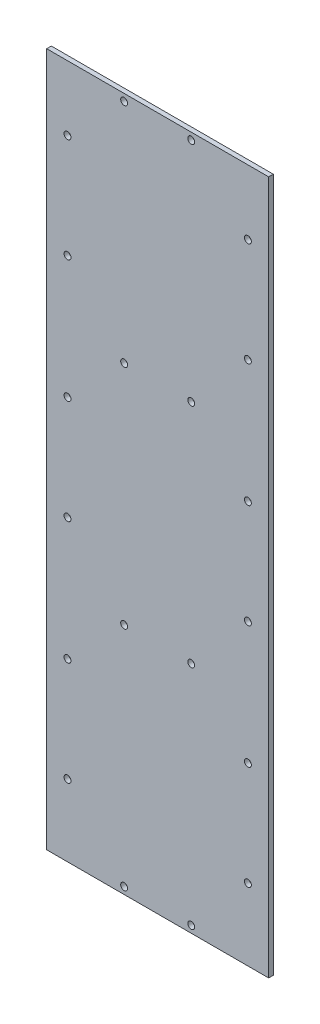
ISO-10303-21;
HEADER;
FILE_DESCRIPTION(('STEP AP214'),'2;1');
FILE_NAME('part.step','',(''),(''),'','','');
FILE_SCHEMA(('AUTOMOTIVE_DESIGN { 1 0 10303 214 1 1 1 1 }'));
ENDSEC;
DATA;
#1=APPLICATION_CONTEXT('core data for automotive mechanical design processes');
#2=APPLICATION_PROTOCOL_DEFINITION('international standard','automotive_design',2000,#1);
#3=PRODUCT_CONTEXT('',#1,'mechanical');
#4=PRODUCT('Part','Part','',(#3));
#5=PRODUCT_RELATED_PRODUCT_CATEGORY('part','',(#4));
#6=PRODUCT_DEFINITION_FORMATION('','',#4);
#7=PRODUCT_DEFINITION_CONTEXT('part definition',#1,'design');
#8=PRODUCT_DEFINITION('design','',#6,#7);
#9=PRODUCT_DEFINITION_SHAPE('','',#8);
#10=(LENGTH_UNIT() NAMED_UNIT(*) SI_UNIT(.MILLI.,.METRE.));
#11=(NAMED_UNIT(*) PLANE_ANGLE_UNIT() SI_UNIT($,.RADIAN.));
#12=(NAMED_UNIT(*) SI_UNIT($,.STERADIAN.) SOLID_ANGLE_UNIT());
#13=UNCERTAINTY_MEASURE_WITH_UNIT(LENGTH_MEASURE(1.E-05),#10,'distance_accuracy_value','');
#14=(GEOMETRIC_REPRESENTATION_CONTEXT(3) GLOBAL_UNCERTAINTY_ASSIGNED_CONTEXT((#13)) GLOBAL_UNIT_ASSIGNED_CONTEXT((#10,
#11,#12)) REPRESENTATION_CONTEXT('',''));
#15=CARTESIAN_POINT('',(0.,0.,0.));
#16=DIRECTION('',(0.,0.,1.));
#17=DIRECTION('',(1.,0.,0.));
#18=AXIS2_PLACEMENT_3D('',#15,#16,#17);
#19=CARTESIAN_POINT('',(-48.,-150.,2.));
#20=DIRECTION('',(1.,0.,0.));
#21=DIRECTION('',(0.,0.,-1.));
#22=AXIS2_PLACEMENT_3D('',#19,#20,#21);
#23=PLANE('',#22);
#24=DIRECTION('',(0.,-1.,0.));
#25=VECTOR('',#24,1.);
#26=CARTESIAN_POINT('',(-48.,-150.,0.));
#27=LINE('',#26,#25);
#28=CARTESIAN_POINT('',(-48.,150.,0.));
#29=VERTEX_POINT('',#28);
#30=CARTESIAN_POINT('',(-48.,-150.,0.));
#31=VERTEX_POINT('',#30);
#32=EDGE_CURVE('E102',#29,#31,#27,.T.);
#33=ORIENTED_EDGE('',*,*,#32,.T.);
#34=DIRECTION('',(0.,0.,-1.));
#35=VECTOR('',#34,1.);
#36=CARTESIAN_POINT('',(-48.,-150.,2.));
#37=LINE('',#36,#35);
#38=CARTESIAN_POINT('',(-48.,-150.,2.));
#39=VERTEX_POINT('',#38);
#40=EDGE_CURVE('E11',#39,#31,#37,.T.);
#41=ORIENTED_EDGE('',*,*,#40,.F.);
#42=DIRECTION('',(0.,-1.,0.));
#43=VECTOR('',#42,1.);
#44=CARTESIAN_POINT('',(-48.,-150.,2.));
#45=LINE('',#44,#43);
#46=CARTESIAN_POINT('',(-48.,150.,2.));
#47=VERTEX_POINT('',#46);
#48=EDGE_CURVE('E89',#47,#39,#45,.T.);
#49=ORIENTED_EDGE('',*,*,#48,.F.);
#50=DIRECTION('',(0.,0.,-1.));
#51=VECTOR('',#50,1.);
#52=CARTESIAN_POINT('',(-48.,150.,2.));
#53=LINE('',#52,#51);
#54=EDGE_CURVE('E98',#47,#29,#53,.T.);
#55=ORIENTED_EDGE('',*,*,#54,.T.);
#56=EDGE_LOOP('',(#33,#41,#49,#55));
#57=FACE_BOUND('',#56,.T.);
#58=ADVANCED_FACE('F36',(#57),#23,.F.);
#59=CARTESIAN_POINT('',(48.,-150.,2.));
#60=DIRECTION('',(0.,1.,0.));
#61=DIRECTION('',(0.,0.,1.));
#62=AXIS2_PLACEMENT_3D('',#59,#60,#61);
#63=PLANE('',#62);
#64=DIRECTION('',(1.,0.,0.));
#65=VECTOR('',#64,1.);
#66=CARTESIAN_POINT('',(48.,-150.,0.));
#67=LINE('',#66,#65);
#68=CARTESIAN_POINT('',(48.,-150.,0.));
#69=VERTEX_POINT('',#68);
#70=EDGE_CURVE('E93',#31,#69,#67,.T.);
#71=ORIENTED_EDGE('',*,*,#70,.T.);
#72=DIRECTION('',(0.,0.,-1.));
#73=VECTOR('',#72,1.);
#74=CARTESIAN_POINT('',(48.,-150.,2.));
#75=LINE('',#74,#73);
#76=CARTESIAN_POINT('',(48.,-150.,2.));
#77=VERTEX_POINT('',#76);
#78=EDGE_CURVE('E45',#77,#69,#75,.T.);
#79=ORIENTED_EDGE('',*,*,#78,.F.);
#80=DIRECTION('',(1.,0.,0.));
#81=VECTOR('',#80,1.);
#82=CARTESIAN_POINT('',(48.,-150.,2.));
#83=LINE('',#82,#81);
#84=EDGE_CURVE('E84',#39,#77,#83,.T.);
#85=ORIENTED_EDGE('',*,*,#84,.F.);
#86=ORIENTED_EDGE('',*,*,#40,.T.);
#87=EDGE_LOOP('',(#71,#79,#85,#86));
#88=FACE_BOUND('',#87,.T.);
#89=ADVANCED_FACE('F92',(#88),#63,.F.);
#90=CARTESIAN_POINT('',(48.,-150.,2.));
#91=DIRECTION('',(-1.,0.,0.));
#92=DIRECTION('',(0.,0.,1.));
#93=AXIS2_PLACEMENT_3D('',#90,#91,#92);
#94=PLANE('',#93);
#95=DIRECTION('',(0.,1.,0.));
#96=VECTOR('',#95,1.);
#97=CARTESIAN_POINT('',(48.,-150.,0.));
#98=LINE('',#97,#96);
#99=CARTESIAN_POINT('',(48.,150.,0.));
#100=VERTEX_POINT('',#99);
#101=EDGE_CURVE('E71',#69,#100,#98,.T.);
#102=ORIENTED_EDGE('',*,*,#101,.T.);
#103=DIRECTION('',(0.,0.,-1.));
#104=VECTOR('',#103,1.);
#105=CARTESIAN_POINT('',(48.,150.,2.));
#106=LINE('',#105,#104);
#107=CARTESIAN_POINT('',(48.,150.,2.));
#108=VERTEX_POINT('',#107);
#109=EDGE_CURVE('E94',#108,#100,#106,.T.);
#110=ORIENTED_EDGE('',*,*,#109,.F.);
#111=DIRECTION('',(0.,1.,0.));
#112=VECTOR('',#111,1.);
#113=CARTESIAN_POINT('',(48.,-150.,2.));
#114=LINE('',#113,#112);
#115=EDGE_CURVE('E87',#77,#108,#114,.T.);
#116=ORIENTED_EDGE('',*,*,#115,.F.);
#117=ORIENTED_EDGE('',*,*,#78,.T.);
#118=EDGE_LOOP('',(#102,#110,#116,#117));
#119=FACE_BOUND('',#118,.T.);
#120=ADVANCED_FACE('F96',(#119),#94,.F.);
#121=CARTESIAN_POINT('',(48.,150.,2.));
#122=DIRECTION('',(0.,-1.,0.));
#123=DIRECTION('',(1.,0.,0.));
#124=AXIS2_PLACEMENT_3D('',#121,#122,#123);
#125=PLANE('',#124);
#126=DIRECTION('',(-1.,0.,0.));
#127=VECTOR('',#126,1.);
#128=CARTESIAN_POINT('',(48.,150.,0.));
#129=LINE('',#128,#127);
#130=EDGE_CURVE('E77',#100,#29,#129,.T.);
#131=ORIENTED_EDGE('',*,*,#130,.T.);
#132=ORIENTED_EDGE('',*,*,#54,.F.);
#133=DIRECTION('',(-1.,0.,0.));
#134=VECTOR('',#133,1.);
#135=CARTESIAN_POINT('',(48.,150.,2.));
#136=LINE('',#135,#134);
#137=EDGE_CURVE('E54',#108,#47,#136,.T.);
#138=ORIENTED_EDGE('',*,*,#137,.F.);
#139=ORIENTED_EDGE('',*,*,#109,.T.);
#140=EDGE_LOOP('',(#131,#132,#138,#139));
#141=FACE_BOUND('',#140,.T.);
#142=ADVANCED_FACE('F203',(#141),#125,.F.);
#143=CARTESIAN_POINT('',(0.,0.,2.));
#144=DIRECTION('',(0.,0.,1.));
#145=DIRECTION('',(1.,0.,0.));
#146=AXIS2_PLACEMENT_3D('',#143,#144,#145);
#147=PLANE('',#146);
#148=CARTESIAN_POINT('',(14.5,-147.,2.));
#149=DIRECTION('',(0.,0.,1.));
#150=DIRECTION('',(1.,0.,0.));
#151=AXIS2_PLACEMENT_3D('',#148,#149,#150);
#152=CIRCLE('',#151,1.5);
#153=CARTESIAN_POINT('',(16.,-147.,2.));
#154=VERTEX_POINT('',#153);
#155=EDGE_CURVE('E478',#154,#154,#152,.T.);
#156=ORIENTED_EDGE('',*,*,#155,.F.);
#157=EDGE_LOOP('',(#156));
#158=FACE_BOUND('',#157,.T.);
#159=CARTESIAN_POINT('',(39.0000000000048,-119.,2.));
#160=DIRECTION('',(0.,0.,1.));
#161=DIRECTION('',(1.,0.,0.));
#162=AXIS2_PLACEMENT_3D('',#159,#160,#161);
#163=CIRCLE('',#162,1.5);
#164=CARTESIAN_POINT('',(40.5000000000048,-119.,2.));
#165=VERTEX_POINT('',#164);
#166=EDGE_CURVE('E472',#165,#165,#163,.T.);
#167=ORIENTED_EDGE('',*,*,#166,.F.);
#168=EDGE_LOOP('',(#167));
#169=FACE_BOUND('',#168,.T.);
#170=CARTESIAN_POINT('',(39.0000000000048,-74.,2.));
#171=DIRECTION('',(0.,0.,1.));
#172=DIRECTION('',(1.,0.,0.));
#173=AXIS2_PLACEMENT_3D('',#170,#171,#172);
#174=CIRCLE('',#173,1.5);
#175=CARTESIAN_POINT('',(40.5000000000048,-74.,2.));
#176=VERTEX_POINT('',#175);
#177=EDGE_CURVE('E416',#176,#176,#174,.T.);
#178=ORIENTED_EDGE('',*,*,#177,.F.);
#179=EDGE_LOOP('',(#178));
#180=FACE_BOUND('',#179,.T.);
#181=CARTESIAN_POINT('',(-38.9999999999952,-119.,2.));
#182=DIRECTION('',(0.,0.,1.));
#183=DIRECTION('',(1.,0.,0.));
#184=AXIS2_PLACEMENT_3D('',#181,#182,#183);
#185=CIRCLE('',#184,1.5);
#186=CARTESIAN_POINT('',(-37.4999999999952,-119.,2.));
#187=VERTEX_POINT('',#186);
#188=EDGE_CURVE('E471',#187,#187,#185,.T.);
#189=ORIENTED_EDGE('',*,*,#188,.F.);
#190=EDGE_LOOP('',(#189));
#191=FACE_BOUND('',#190,.T.);
#192=CARTESIAN_POINT('',(14.4999999999993,49.,2.));
#193=DIRECTION('',(0.,0.,1.));
#194=DIRECTION('',(1.,0.,0.));
#195=AXIS2_PLACEMENT_3D('',#192,#193,#194);
#196=CIRCLE('',#195,1.5);
#197=CARTESIAN_POINT('',(15.9999999999993,49.,2.));
#198=VERTEX_POINT('',#197);
#199=EDGE_CURVE('E532',#198,#198,#196,.T.);
#200=ORIENTED_EDGE('',*,*,#199,.F.);
#201=EDGE_LOOP('',(#200));
#202=FACE_BOUND('',#201,.T.);
#203=CARTESIAN_POINT('',(-14.5000000000003,-49.,2.));
#204=DIRECTION('',(0.,0.,1.));
#205=DIRECTION('',(-1.,0.,0.));
#206=AXIS2_PLACEMENT_3D('',#203,#204,#205);
#207=CIRCLE('',#206,1.5);
#208=CARTESIAN_POINT('',(-16.0000000000003,-49.,2.));
#209=VERTEX_POINT('',#208);
#210=EDGE_CURVE('E535',#209,#209,#207,.T.);
#211=ORIENTED_EDGE('',*,*,#210,.F.);
#212=EDGE_LOOP('',(#211));
#213=FACE_BOUND('',#212,.T.);
#214=CARTESIAN_POINT('',(-14.5,-147.,2.));
#215=DIRECTION('',(0.,0.,1.));
#216=DIRECTION('',(-1.,0.,0.));
#217=AXIS2_PLACEMENT_3D('',#214,#215,#216);
#218=CIRCLE('',#217,1.5);
#219=CARTESIAN_POINT('',(-16.,-147.,2.));
#220=VERTEX_POINT('',#219);
#221=EDGE_CURVE('E541',#220,#220,#218,.T.);
#222=ORIENTED_EDGE('',*,*,#221,.F.);
#223=EDGE_LOOP('',(#222));
#224=FACE_BOUND('',#223,.T.);
#225=CARTESIAN_POINT('',(14.4999999999997,-49.,2.));
#226=DIRECTION('',(0.,0.,1.));
#227=DIRECTION('',(1.,0.,0.));
#228=AXIS2_PLACEMENT_3D('',#225,#226,#227);
#229=CIRCLE('',#228,1.5);
#230=CARTESIAN_POINT('',(15.9999999999997,-49.,2.));
#231=VERTEX_POINT('',#230);
#232=EDGE_CURVE('E543',#231,#231,#229,.T.);
#233=ORIENTED_EDGE('',*,*,#232,.F.);
#234=EDGE_LOOP('',(#233));
#235=FACE_BOUND('',#234,.T.);
#236=CARTESIAN_POINT('',(-38.9999999999976,24.,2.));
#237=DIRECTION('',(0.,0.,1.));
#238=DIRECTION('',(1.,0.,0.));
#239=AXIS2_PLACEMENT_3D('',#236,#237,#238);
#240=CIRCLE('',#239,1.5);
#241=CARTESIAN_POINT('',(-37.4999999999976,24.,2.));
#242=VERTEX_POINT('',#241);
#243=EDGE_CURVE('E491',#242,#242,#240,.T.);
#244=ORIENTED_EDGE('',*,*,#243,.F.);
#245=EDGE_LOOP('',(#244));
#246=FACE_BOUND('',#245,.T.);
#247=CARTESIAN_POINT('',(39.,77.,2.));
#248=DIRECTION('',(0.,0.,1.));
#249=DIRECTION('',(1.,0.,0.));
#250=AXIS2_PLACEMENT_3D('',#247,#248,#249);
#251=CIRCLE('',#250,1.5);
#252=CARTESIAN_POINT('',(40.5,77.,2.));
#253=VERTEX_POINT('',#252);
#254=EDGE_CURVE('E494',#253,#253,#251,.T.);
#255=ORIENTED_EDGE('',*,*,#254,.F.);
#256=EDGE_LOOP('',(#255));
#257=FACE_BOUND('',#256,.T.);
#258=CARTESIAN_POINT('',(39.,122.,2.));
#259=DIRECTION('',(0.,0.,1.));
#260=DIRECTION('',(1.,0.,0.));
#261=AXIS2_PLACEMENT_3D('',#258,#259,#260);
#262=CIRCLE('',#261,1.5);
#263=CARTESIAN_POINT('',(40.5,122.,2.));
#264=VERTEX_POINT('',#263);
#265=EDGE_CURVE('E497',#264,#264,#262,.T.);
#266=ORIENTED_EDGE('',*,*,#265,.F.);
#267=EDGE_LOOP('',(#266));
#268=FACE_BOUND('',#267,.T.);
#269=CARTESIAN_POINT('',(-39.,77.,2.));
#270=DIRECTION('',(0.,0.,1.));
#271=DIRECTION('',(1.,0.,0.));
#272=AXIS2_PLACEMENT_3D('',#269,#270,#271);
#273=CIRCLE('',#272,1.5);
#274=CARTESIAN_POINT('',(-37.5,77.,2.));
#275=VERTEX_POINT('',#274);
#276=EDGE_CURVE('E500',#275,#275,#273,.T.);
#277=ORIENTED_EDGE('',*,*,#276,.F.);
#278=EDGE_LOOP('',(#277));
#279=FACE_BOUND('',#278,.T.);
#280=CARTESIAN_POINT('',(-38.9999999999952,-74.,2.));
#281=DIRECTION('',(0.,0.,1.));
#282=DIRECTION('',(1.,0.,0.));
#283=AXIS2_PLACEMENT_3D('',#280,#281,#282);
#284=CIRCLE('',#283,1.5);
#285=CARTESIAN_POINT('',(-37.4999999999952,-74.,2.));
#286=VERTEX_POINT('',#285);
#287=EDGE_CURVE('E475',#286,#286,#284,.T.);
#288=ORIENTED_EDGE('',*,*,#287,.F.);
#289=EDGE_LOOP('',(#288));
#290=FACE_BOUND('',#289,.T.);
#291=CARTESIAN_POINT('',(39.0000000000024,-21.,2.));
#292=DIRECTION('',(0.,0.,1.));
#293=DIRECTION('',(1.,0.,0.));
#294=AXIS2_PLACEMENT_3D('',#291,#292,#293);
#295=CIRCLE('',#294,1.5);
#296=CARTESIAN_POINT('',(40.5000000000024,-21.,2.));
#297=VERTEX_POINT('',#296);
#298=EDGE_CURVE('E482',#297,#297,#295,.T.);
#299=ORIENTED_EDGE('',*,*,#298,.F.);
#300=EDGE_LOOP('',(#299));
#301=FACE_BOUND('',#300,.T.);
#302=CARTESIAN_POINT('',(39.0000000000024,24.,2.));
#303=DIRECTION('',(0.,0.,1.));
#304=DIRECTION('',(1.,0.,0.));
#305=AXIS2_PLACEMENT_3D('',#302,#303,#304);
#306=CIRCLE('',#305,1.5);
#307=CARTESIAN_POINT('',(40.5000000000024,24.,2.));
#308=VERTEX_POINT('',#307);
#309=EDGE_CURVE('E485',#308,#308,#306,.T.);
#310=ORIENTED_EDGE('',*,*,#309,.F.);
#311=EDGE_LOOP('',(#310));
#312=FACE_BOUND('',#311,.T.);
#313=CARTESIAN_POINT('',(-38.9999999999976,-21.,2.));
#314=DIRECTION('',(0.,0.,1.));
#315=DIRECTION('',(1.,0.,0.));
#316=AXIS2_PLACEMENT_3D('',#313,#314,#315);
#317=CIRCLE('',#316,1.5);
#318=CARTESIAN_POINT('',(-37.4999999999976,-21.,2.));
#319=VERTEX_POINT('',#318);
#320=EDGE_CURVE('E488',#319,#319,#317,.T.);
#321=ORIENTED_EDGE('',*,*,#320,.F.);
#322=EDGE_LOOP('',(#321));
#323=FACE_BOUND('',#322,.T.);
#324=CARTESIAN_POINT('',(-14.500000000001,147.,2.));
#325=DIRECTION('',(0.,0.,1.));
#326=DIRECTION('',(-1.,0.,0.));
#327=AXIS2_PLACEMENT_3D('',#324,#325,#326);
#328=CIRCLE('',#327,1.5);
#329=CARTESIAN_POINT('',(-16.000000000001,147.,2.));
#330=VERTEX_POINT('',#329);
#331=EDGE_CURVE('E524',#330,#330,#328,.T.);
#332=ORIENTED_EDGE('',*,*,#331,.F.);
#333=EDGE_LOOP('',(#332));
#334=FACE_BOUND('',#333,.T.);
#335=CARTESIAN_POINT('',(14.499999999999,147.,2.));
#336=DIRECTION('',(0.,0.,1.));
#337=DIRECTION('',(1.,0.,0.));
#338=AXIS2_PLACEMENT_3D('',#335,#336,#337);
#339=CIRCLE('',#338,1.5);
#340=CARTESIAN_POINT('',(15.999999999999,147.,2.));
#341=VERTEX_POINT('',#340);
#342=EDGE_CURVE('E528',#341,#341,#339,.T.);
#343=ORIENTED_EDGE('',*,*,#342,.F.);
#344=EDGE_LOOP('',(#343));
#345=FACE_BOUND('',#344,.T.);
#346=CARTESIAN_POINT('',(-14.5000000000007,49.,2.));
#347=DIRECTION('',(0.,0.,1.));
#348=DIRECTION('',(-1.,0.,0.));
#349=AXIS2_PLACEMENT_3D('',#346,#347,#348);
#350=CIRCLE('',#349,1.5);
#351=CARTESIAN_POINT('',(-16.0000000000007,49.,2.));
#352=VERTEX_POINT('',#351);
#353=EDGE_CURVE('E531',#352,#352,#350,.T.);
#354=ORIENTED_EDGE('',*,*,#353,.F.);
#355=EDGE_LOOP('',(#354));
#356=FACE_BOUND('',#355,.T.);
#357=CARTESIAN_POINT('',(-39.,122.,2.));
#358=DIRECTION('',(0.,0.,1.));
#359=DIRECTION('',(1.,0.,0.));
#360=AXIS2_PLACEMENT_3D('',#357,#358,#359);
#361=CIRCLE('',#360,1.5);
#362=CARTESIAN_POINT('',(-37.5,122.,2.));
#363=VERTEX_POINT('',#362);
#364=EDGE_CURVE('E114',#363,#363,#361,.T.);
#365=ORIENTED_EDGE('',*,*,#364,.F.);
#366=EDGE_LOOP('',(#365));
#367=FACE_BOUND('',#366,.T.);
#368=ORIENTED_EDGE('',*,*,#48,.T.);
#369=ORIENTED_EDGE('',*,*,#84,.T.);
#370=ORIENTED_EDGE('',*,*,#115,.T.);
#371=ORIENTED_EDGE('',*,*,#137,.T.);
#372=EDGE_LOOP('',(#368,#369,#370,#371));
#373=FACE_BOUND('',#372,.T.);
#374=ADVANCED_FACE('F85',(#158,#169,#180,#191,#202,#213,#224,#235,#246,#257,#268,#279,#290,#301,
#312,#323,#334,#345,#356,#367,#373),#147,.T.);
#375=CARTESIAN_POINT('',(0.,0.,0.));
#376=DIRECTION('',(0.,0.,1.));
#377=DIRECTION('',(1.,0.,0.));
#378=AXIS2_PLACEMENT_3D('',#375,#376,#377);
#379=PLANE('',#378);
#380=CARTESIAN_POINT('',(14.5,-147.,0.));
#381=DIRECTION('',(0.,0.,1.));
#382=DIRECTION('',(1.,0.,0.));
#383=AXIS2_PLACEMENT_3D('',#380,#381,#382);
#384=CIRCLE('',#383,1.5);
#385=CARTESIAN_POINT('',(16.,-147.,0.));
#386=VERTEX_POINT('',#385);
#387=EDGE_CURVE('E39',#386,#386,#384,.T.);
#388=ORIENTED_EDGE('',*,*,#387,.T.);
#389=EDGE_LOOP('',(#388));
#390=FACE_BOUND('',#389,.T.);
#391=CARTESIAN_POINT('',(39.0000000000048,-119.,0.));
#392=DIRECTION('',(0.,0.,1.));
#393=DIRECTION('',(1.,0.,0.));
#394=AXIS2_PLACEMENT_3D('',#391,#392,#393);
#395=CIRCLE('',#394,1.5);
#396=CARTESIAN_POINT('',(40.5000000000048,-119.,0.));
#397=VERTEX_POINT('',#396);
#398=EDGE_CURVE('E164',#397,#397,#395,.T.);
#399=ORIENTED_EDGE('',*,*,#398,.T.);
#400=EDGE_LOOP('',(#399));
#401=FACE_BOUND('',#400,.T.);
#402=CARTESIAN_POINT('',(39.0000000000048,-74.,0.));
#403=DIRECTION('',(0.,0.,1.));
#404=DIRECTION('',(1.,0.,0.));
#405=AXIS2_PLACEMENT_3D('',#402,#403,#404);
#406=CIRCLE('',#405,1.5);
#407=CARTESIAN_POINT('',(40.5000000000048,-74.,0.));
#408=VERTEX_POINT('',#407);
#409=EDGE_CURVE('E162',#408,#408,#406,.T.);
#410=ORIENTED_EDGE('',*,*,#409,.T.);
#411=EDGE_LOOP('',(#410));
#412=FACE_BOUND('',#411,.T.);
#413=CARTESIAN_POINT('',(-38.9999999999952,-119.,0.));
#414=DIRECTION('',(0.,0.,1.));
#415=DIRECTION('',(1.,0.,0.));
#416=AXIS2_PLACEMENT_3D('',#413,#414,#415);
#417=CIRCLE('',#416,1.5);
#418=CARTESIAN_POINT('',(-37.4999999999952,-119.,0.));
#419=VERTEX_POINT('',#418);
#420=EDGE_CURVE('E159',#419,#419,#417,.T.);
#421=ORIENTED_EDGE('',*,*,#420,.T.);
#422=EDGE_LOOP('',(#421));
#423=FACE_BOUND('',#422,.T.);
#424=CARTESIAN_POINT('',(14.4999999999993,49.,0.));
#425=DIRECTION('',(0.,0.,1.));
#426=DIRECTION('',(1.,0.,0.));
#427=AXIS2_PLACEMENT_3D('',#424,#425,#426);
#428=CIRCLE('',#427,1.5);
#429=CARTESIAN_POINT('',(15.9999999999993,49.,0.));
#430=VERTEX_POINT('',#429);
#431=EDGE_CURVE('E156',#430,#430,#428,.T.);
#432=ORIENTED_EDGE('',*,*,#431,.T.);
#433=EDGE_LOOP('',(#432));
#434=FACE_BOUND('',#433,.T.);
#435=CARTESIAN_POINT('',(-14.5000000000003,-49.,0.));
#436=DIRECTION('',(0.,0.,1.));
#437=DIRECTION('',(1.,0.,0.));
#438=AXIS2_PLACEMENT_3D('',#435,#436,#437);
#439=CIRCLE('',#438,1.5);
#440=CARTESIAN_POINT('',(-13.0000000000003,-49.,0.));
#441=VERTEX_POINT('',#440);
#442=EDGE_CURVE('E153',#441,#441,#439,.T.);
#443=ORIENTED_EDGE('',*,*,#442,.T.);
#444=EDGE_LOOP('',(#443));
#445=FACE_BOUND('',#444,.T.);
#446=CARTESIAN_POINT('',(-14.5,-147.,0.));
#447=DIRECTION('',(0.,0.,1.));
#448=DIRECTION('',(1.,0.,0.));
#449=AXIS2_PLACEMENT_3D('',#446,#447,#448);
#450=CIRCLE('',#449,1.5);
#451=CARTESIAN_POINT('',(-13.,-147.,0.));
#452=VERTEX_POINT('',#451);
#453=EDGE_CURVE('E150',#452,#452,#450,.T.);
#454=ORIENTED_EDGE('',*,*,#453,.T.);
#455=EDGE_LOOP('',(#454));
#456=FACE_BOUND('',#455,.T.);
#457=CARTESIAN_POINT('',(14.4999999999997,-49.,0.));
#458=DIRECTION('',(0.,0.,1.));
#459=DIRECTION('',(1.,0.,0.));
#460=AXIS2_PLACEMENT_3D('',#457,#458,#459);
#461=CIRCLE('',#460,1.5);
#462=CARTESIAN_POINT('',(15.9999999999997,-49.,0.));
#463=VERTEX_POINT('',#462);
#464=EDGE_CURVE('E147',#463,#463,#461,.T.);
#465=ORIENTED_EDGE('',*,*,#464,.T.);
#466=EDGE_LOOP('',(#465));
#467=FACE_BOUND('',#466,.T.);
#468=CARTESIAN_POINT('',(-38.9999999999976,24.,0.));
#469=DIRECTION('',(0.,0.,1.));
#470=DIRECTION('',(1.,0.,0.));
#471=AXIS2_PLACEMENT_3D('',#468,#469,#470);
#472=CIRCLE('',#471,1.5);
#473=CARTESIAN_POINT('',(-37.4999999999976,24.,0.));
#474=VERTEX_POINT('',#473);
#475=EDGE_CURVE('E144',#474,#474,#472,.T.);
#476=ORIENTED_EDGE('',*,*,#475,.T.);
#477=EDGE_LOOP('',(#476));
#478=FACE_BOUND('',#477,.T.);
#479=CARTESIAN_POINT('',(39.,77.,0.));
#480=DIRECTION('',(0.,0.,1.));
#481=DIRECTION('',(1.,0.,0.));
#482=AXIS2_PLACEMENT_3D('',#479,#480,#481);
#483=CIRCLE('',#482,1.5);
#484=CARTESIAN_POINT('',(40.5,77.,0.));
#485=VERTEX_POINT('',#484);
#486=EDGE_CURVE('E141',#485,#485,#483,.T.);
#487=ORIENTED_EDGE('',*,*,#486,.T.);
#488=EDGE_LOOP('',(#487));
#489=FACE_BOUND('',#488,.T.);
#490=CARTESIAN_POINT('',(39.,122.,0.));
#491=DIRECTION('',(0.,0.,1.));
#492=DIRECTION('',(1.,0.,0.));
#493=AXIS2_PLACEMENT_3D('',#490,#491,#492);
#494=CIRCLE('',#493,1.5);
#495=CARTESIAN_POINT('',(40.5,122.,0.));
#496=VERTEX_POINT('',#495);
#497=EDGE_CURVE('E138',#496,#496,#494,.T.);
#498=ORIENTED_EDGE('',*,*,#497,.T.);
#499=EDGE_LOOP('',(#498));
#500=FACE_BOUND('',#499,.T.);
#501=CARTESIAN_POINT('',(-39.,77.,0.));
#502=DIRECTION('',(0.,0.,1.));
#503=DIRECTION('',(1.,0.,0.));
#504=AXIS2_PLACEMENT_3D('',#501,#502,#503);
#505=CIRCLE('',#504,1.5);
#506=CARTESIAN_POINT('',(-37.5,77.,0.));
#507=VERTEX_POINT('',#506);
#508=EDGE_CURVE('E135',#507,#507,#505,.T.);
#509=ORIENTED_EDGE('',*,*,#508,.T.);
#510=EDGE_LOOP('',(#509));
#511=FACE_BOUND('',#510,.T.);
#512=CARTESIAN_POINT('',(-38.9999999999952,-74.,0.));
#513=DIRECTION('',(0.,0.,1.));
#514=DIRECTION('',(1.,0.,0.));
#515=AXIS2_PLACEMENT_3D('',#512,#513,#514);
#516=CIRCLE('',#515,1.5);
#517=CARTESIAN_POINT('',(-37.4999999999952,-74.,0.));
#518=VERTEX_POINT('',#517);
#519=EDGE_CURVE('E132',#518,#518,#516,.T.);
#520=ORIENTED_EDGE('',*,*,#519,.T.);
#521=EDGE_LOOP('',(#520));
#522=FACE_BOUND('',#521,.T.);
#523=CARTESIAN_POINT('',(39.0000000000024,-21.,0.));
#524=DIRECTION('',(0.,0.,1.));
#525=DIRECTION('',(1.,0.,0.));
#526=AXIS2_PLACEMENT_3D('',#523,#524,#525);
#527=CIRCLE('',#526,1.5);
#528=CARTESIAN_POINT('',(40.5000000000024,-21.,0.));
#529=VERTEX_POINT('',#528);
#530=EDGE_CURVE('E129',#529,#529,#527,.T.);
#531=ORIENTED_EDGE('',*,*,#530,.T.);
#532=EDGE_LOOP('',(#531));
#533=FACE_BOUND('',#532,.T.);
#534=CARTESIAN_POINT('',(39.0000000000024,24.,0.));
#535=DIRECTION('',(0.,0.,1.));
#536=DIRECTION('',(1.,0.,0.));
#537=AXIS2_PLACEMENT_3D('',#534,#535,#536);
#538=CIRCLE('',#537,1.5);
#539=CARTESIAN_POINT('',(40.5000000000024,24.,0.));
#540=VERTEX_POINT('',#539);
#541=EDGE_CURVE('E126',#540,#540,#538,.T.);
#542=ORIENTED_EDGE('',*,*,#541,.T.);
#543=EDGE_LOOP('',(#542));
#544=FACE_BOUND('',#543,.T.);
#545=CARTESIAN_POINT('',(-38.9999999999976,-21.,0.));
#546=DIRECTION('',(0.,0.,1.));
#547=DIRECTION('',(1.,0.,0.));
#548=AXIS2_PLACEMENT_3D('',#545,#546,#547);
#549=CIRCLE('',#548,1.5);
#550=CARTESIAN_POINT('',(-37.4999999999976,-21.,0.));
#551=VERTEX_POINT('',#550);
#552=EDGE_CURVE('E123',#551,#551,#549,.T.);
#553=ORIENTED_EDGE('',*,*,#552,.T.);
#554=EDGE_LOOP('',(#553));
#555=FACE_BOUND('',#554,.T.);
#556=CARTESIAN_POINT('',(-14.500000000001,147.,0.));
#557=DIRECTION('',(0.,0.,1.));
#558=DIRECTION('',(1.,0.,0.));
#559=AXIS2_PLACEMENT_3D('',#556,#557,#558);
#560=CIRCLE('',#559,1.5);
#561=CARTESIAN_POINT('',(-13.000000000001,147.,0.));
#562=VERTEX_POINT('',#561);
#563=EDGE_CURVE('E120',#562,#562,#560,.T.);
#564=ORIENTED_EDGE('',*,*,#563,.T.);
#565=EDGE_LOOP('',(#564));
#566=FACE_BOUND('',#565,.T.);
#567=CARTESIAN_POINT('',(14.499999999999,147.,0.));
#568=DIRECTION('',(0.,0.,1.));
#569=DIRECTION('',(1.,0.,0.));
#570=AXIS2_PLACEMENT_3D('',#567,#568,#569);
#571=CIRCLE('',#570,1.5);
#572=CARTESIAN_POINT('',(15.999999999999,147.,0.));
#573=VERTEX_POINT('',#572);
#574=EDGE_CURVE('E117',#573,#573,#571,.T.);
#575=ORIENTED_EDGE('',*,*,#574,.T.);
#576=EDGE_LOOP('',(#575));
#577=FACE_BOUND('',#576,.T.);
#578=CARTESIAN_POINT('',(-14.5000000000007,49.,0.));
#579=DIRECTION('',(0.,0.,1.));
#580=DIRECTION('',(1.,0.,0.));
#581=AXIS2_PLACEMENT_3D('',#578,#579,#580);
#582=CIRCLE('',#581,1.5);
#583=CARTESIAN_POINT('',(-13.0000000000007,49.,0.));
#584=VERTEX_POINT('',#583);
#585=EDGE_CURVE('E113',#584,#584,#582,.T.);
#586=ORIENTED_EDGE('',*,*,#585,.T.);
#587=EDGE_LOOP('',(#586));
#588=FACE_BOUND('',#587,.T.);
#589=CARTESIAN_POINT('',(-39.,122.,0.));
#590=DIRECTION('',(0.,0.,1.));
#591=DIRECTION('',(1.,0.,0.));
#592=AXIS2_PLACEMENT_3D('',#589,#590,#591);
#593=CIRCLE('',#592,1.5);
#594=CARTESIAN_POINT('',(-37.5,122.,0.));
#595=VERTEX_POINT('',#594);
#596=EDGE_CURVE('E110',#595,#595,#593,.T.);
#597=ORIENTED_EDGE('',*,*,#596,.T.);
#598=EDGE_LOOP('',(#597));
#599=FACE_BOUND('',#598,.T.);
#600=ORIENTED_EDGE('',*,*,#32,.F.);
#601=ORIENTED_EDGE('',*,*,#130,.F.);
#602=ORIENTED_EDGE('',*,*,#101,.F.);
#603=ORIENTED_EDGE('',*,*,#70,.F.);
#604=EDGE_LOOP('',(#600,#601,#602,#603));
#605=FACE_BOUND('',#604,.T.);
#606=ADVANCED_FACE('F171',(#390,#401,#412,#423,#434,#445,#456,#467,#478,#489,#500,#511,#522,
#533,#544,#555,#566,#577,#588,#599,#605),#379,.F.);
#607=CARTESIAN_POINT('',(-39.,122.,-8.));
#608=DIRECTION('',(0.,0.,1.));
#609=DIRECTION('',(1.,0.,0.));
#610=AXIS2_PLACEMENT_3D('',#607,#608,#609);
#611=CYLINDRICAL_SURFACE('',#610,1.5);
#612=ORIENTED_EDGE('',*,*,#364,.T.);
#613=EDGE_LOOP('',(#612));
#614=FACE_BOUND('',#613,.T.);
#615=ORIENTED_EDGE('',*,*,#596,.F.);
#616=EDGE_LOOP('',(#615));
#617=FACE_BOUND('',#616,.T.);
#618=ADVANCED_FACE('F194',(#614,#617),#611,.F.);
#619=CARTESIAN_POINT('',(-14.5000000000007,49.,-8.));
#620=DIRECTION('',(0.,0.,1.));
#621=DIRECTION('',(1.,0.,0.));
#622=AXIS2_PLACEMENT_3D('',#619,#620,#621);
#623=CYLINDRICAL_SURFACE('',#622,1.5);
#624=ORIENTED_EDGE('',*,*,#353,.T.);
#625=EDGE_LOOP('',(#624));
#626=FACE_BOUND('',#625,.T.);
#627=ORIENTED_EDGE('',*,*,#585,.F.);
#628=EDGE_LOOP('',(#627));
#629=FACE_BOUND('',#628,.T.);
#630=ADVANCED_FACE('F200',(#626,#629),#623,.F.);
#631=CARTESIAN_POINT('',(14.499999999999,147.,-8.));
#632=DIRECTION('',(0.,0.,1.));
#633=DIRECTION('',(1.,0.,0.));
#634=AXIS2_PLACEMENT_3D('',#631,#632,#633);
#635=CYLINDRICAL_SURFACE('',#634,1.5);
#636=ORIENTED_EDGE('',*,*,#342,.T.);
#637=EDGE_LOOP('',(#636));
#638=FACE_BOUND('',#637,.T.);
#639=ORIENTED_EDGE('',*,*,#574,.F.);
#640=EDGE_LOOP('',(#639));
#641=FACE_BOUND('',#640,.T.);
#642=ADVANCED_FACE('F241',(#638,#641),#635,.F.);
#643=CARTESIAN_POINT('',(-14.500000000001,147.,-8.));
#644=DIRECTION('',(0.,0.,1.));
#645=DIRECTION('',(1.,0.,0.));
#646=AXIS2_PLACEMENT_3D('',#643,#644,#645);
#647=CYLINDRICAL_SURFACE('',#646,1.5);
#648=ORIENTED_EDGE('',*,*,#331,.T.);
#649=EDGE_LOOP('',(#648));
#650=FACE_BOUND('',#649,.T.);
#651=ORIENTED_EDGE('',*,*,#563,.F.);
#652=EDGE_LOOP('',(#651));
#653=FACE_BOUND('',#652,.T.);
#654=ADVANCED_FACE('F251',(#650,#653),#647,.F.);
#655=CARTESIAN_POINT('',(-38.9999999999976,-21.,-8.));
#656=DIRECTION('',(0.,0.,1.));
#657=DIRECTION('',(1.,0.,0.));
#658=AXIS2_PLACEMENT_3D('',#655,#656,#657);
#659=CYLINDRICAL_SURFACE('',#658,1.5);
#660=ORIENTED_EDGE('',*,*,#320,.T.);
#661=EDGE_LOOP('',(#660));
#662=FACE_BOUND('',#661,.T.);
#663=ORIENTED_EDGE('',*,*,#552,.F.);
#664=EDGE_LOOP('',(#663));
#665=FACE_BOUND('',#664,.T.);
#666=ADVANCED_FACE('F261',(#662,#665),#659,.F.);
#667=CARTESIAN_POINT('',(39.0000000000024,24.,-8.));
#668=DIRECTION('',(0.,0.,1.));
#669=DIRECTION('',(1.,0.,0.));
#670=AXIS2_PLACEMENT_3D('',#667,#668,#669);
#671=CYLINDRICAL_SURFACE('',#670,1.5);
#672=ORIENTED_EDGE('',*,*,#309,.T.);
#673=EDGE_LOOP('',(#672));
#674=FACE_BOUND('',#673,.T.);
#675=ORIENTED_EDGE('',*,*,#541,.F.);
#676=EDGE_LOOP('',(#675));
#677=FACE_BOUND('',#676,.T.);
#678=ADVANCED_FACE('F271',(#674,#677),#671,.F.);
#679=CARTESIAN_POINT('',(39.0000000000024,-21.,-8.));
#680=DIRECTION('',(0.,0.,1.));
#681=DIRECTION('',(1.,0.,0.));
#682=AXIS2_PLACEMENT_3D('',#679,#680,#681);
#683=CYLINDRICAL_SURFACE('',#682,1.5);
#684=ORIENTED_EDGE('',*,*,#298,.T.);
#685=EDGE_LOOP('',(#684));
#686=FACE_BOUND('',#685,.T.);
#687=ORIENTED_EDGE('',*,*,#530,.F.);
#688=EDGE_LOOP('',(#687));
#689=FACE_BOUND('',#688,.T.);
#690=ADVANCED_FACE('F281',(#686,#689),#683,.F.);
#691=CARTESIAN_POINT('',(-38.9999999999952,-74.,-8.));
#692=DIRECTION('',(0.,0.,1.));
#693=DIRECTION('',(1.,0.,0.));
#694=AXIS2_PLACEMENT_3D('',#691,#692,#693);
#695=CYLINDRICAL_SURFACE('',#694,1.5);
#696=ORIENTED_EDGE('',*,*,#287,.T.);
#697=EDGE_LOOP('',(#696));
#698=FACE_BOUND('',#697,.T.);
#699=ORIENTED_EDGE('',*,*,#519,.F.);
#700=EDGE_LOOP('',(#699));
#701=FACE_BOUND('',#700,.T.);
#702=ADVANCED_FACE('F291',(#698,#701),#695,.F.);
#703=CARTESIAN_POINT('',(-39.,77.,-8.));
#704=DIRECTION('',(0.,0.,1.));
#705=DIRECTION('',(1.,0.,0.));
#706=AXIS2_PLACEMENT_3D('',#703,#704,#705);
#707=CYLINDRICAL_SURFACE('',#706,1.5);
#708=ORIENTED_EDGE('',*,*,#276,.T.);
#709=EDGE_LOOP('',(#708));
#710=FACE_BOUND('',#709,.T.);
#711=ORIENTED_EDGE('',*,*,#508,.F.);
#712=EDGE_LOOP('',(#711));
#713=FACE_BOUND('',#712,.T.);
#714=ADVANCED_FACE('F301',(#710,#713),#707,.F.);
#715=CARTESIAN_POINT('',(39.,122.,-8.));
#716=DIRECTION('',(0.,0.,1.));
#717=DIRECTION('',(1.,0.,0.));
#718=AXIS2_PLACEMENT_3D('',#715,#716,#717);
#719=CYLINDRICAL_SURFACE('',#718,1.5);
#720=ORIENTED_EDGE('',*,*,#265,.T.);
#721=EDGE_LOOP('',(#720));
#722=FACE_BOUND('',#721,.T.);
#723=ORIENTED_EDGE('',*,*,#497,.F.);
#724=EDGE_LOOP('',(#723));
#725=FACE_BOUND('',#724,.T.);
#726=ADVANCED_FACE('F311',(#722,#725),#719,.F.);
#727=CARTESIAN_POINT('',(39.,77.,-8.));
#728=DIRECTION('',(0.,0.,1.));
#729=DIRECTION('',(1.,0.,0.));
#730=AXIS2_PLACEMENT_3D('',#727,#728,#729);
#731=CYLINDRICAL_SURFACE('',#730,1.5);
#732=ORIENTED_EDGE('',*,*,#254,.T.);
#733=EDGE_LOOP('',(#732));
#734=FACE_BOUND('',#733,.T.);
#735=ORIENTED_EDGE('',*,*,#486,.F.);
#736=EDGE_LOOP('',(#735));
#737=FACE_BOUND('',#736,.T.);
#738=ADVANCED_FACE('F321',(#734,#737),#731,.F.);
#739=CARTESIAN_POINT('',(-38.9999999999976,24.,-8.));
#740=DIRECTION('',(0.,0.,1.));
#741=DIRECTION('',(1.,0.,0.));
#742=AXIS2_PLACEMENT_3D('',#739,#740,#741);
#743=CYLINDRICAL_SURFACE('',#742,1.5);
#744=ORIENTED_EDGE('',*,*,#243,.T.);
#745=EDGE_LOOP('',(#744));
#746=FACE_BOUND('',#745,.T.);
#747=ORIENTED_EDGE('',*,*,#475,.F.);
#748=EDGE_LOOP('',(#747));
#749=FACE_BOUND('',#748,.T.);
#750=ADVANCED_FACE('F331',(#746,#749),#743,.F.);
#751=CARTESIAN_POINT('',(14.4999999999997,-49.,-8.));
#752=DIRECTION('',(0.,0.,1.));
#753=DIRECTION('',(1.,0.,0.));
#754=AXIS2_PLACEMENT_3D('',#751,#752,#753);
#755=CYLINDRICAL_SURFACE('',#754,1.5);
#756=ORIENTED_EDGE('',*,*,#232,.T.);
#757=EDGE_LOOP('',(#756));
#758=FACE_BOUND('',#757,.T.);
#759=ORIENTED_EDGE('',*,*,#464,.F.);
#760=EDGE_LOOP('',(#759));
#761=FACE_BOUND('',#760,.T.);
#762=ADVANCED_FACE('F341',(#758,#761),#755,.F.);
#763=CARTESIAN_POINT('',(-14.5,-147.,-8.));
#764=DIRECTION('',(0.,0.,1.));
#765=DIRECTION('',(1.,0.,0.));
#766=AXIS2_PLACEMENT_3D('',#763,#764,#765);
#767=CYLINDRICAL_SURFACE('',#766,1.5);
#768=ORIENTED_EDGE('',*,*,#221,.T.);
#769=EDGE_LOOP('',(#768));
#770=FACE_BOUND('',#769,.T.);
#771=ORIENTED_EDGE('',*,*,#453,.F.);
#772=EDGE_LOOP('',(#771));
#773=FACE_BOUND('',#772,.T.);
#774=ADVANCED_FACE('F351',(#770,#773),#767,.F.);
#775=CARTESIAN_POINT('',(-14.5000000000003,-49.,-8.));
#776=DIRECTION('',(0.,0.,1.));
#777=DIRECTION('',(1.,0.,0.));
#778=AXIS2_PLACEMENT_3D('',#775,#776,#777);
#779=CYLINDRICAL_SURFACE('',#778,1.5);
#780=ORIENTED_EDGE('',*,*,#210,.T.);
#781=EDGE_LOOP('',(#780));
#782=FACE_BOUND('',#781,.T.);
#783=ORIENTED_EDGE('',*,*,#442,.F.);
#784=EDGE_LOOP('',(#783));
#785=FACE_BOUND('',#784,.T.);
#786=ADVANCED_FACE('F361',(#782,#785),#779,.F.);
#787=CARTESIAN_POINT('',(14.4999999999993,49.,-8.));
#788=DIRECTION('',(0.,0.,1.));
#789=DIRECTION('',(1.,0.,0.));
#790=AXIS2_PLACEMENT_3D('',#787,#788,#789);
#791=CYLINDRICAL_SURFACE('',#790,1.5);
#792=ORIENTED_EDGE('',*,*,#199,.T.);
#793=EDGE_LOOP('',(#792));
#794=FACE_BOUND('',#793,.T.);
#795=ORIENTED_EDGE('',*,*,#431,.F.);
#796=EDGE_LOOP('',(#795));
#797=FACE_BOUND('',#796,.T.);
#798=ADVANCED_FACE('F371',(#794,#797),#791,.F.);
#799=CARTESIAN_POINT('',(-38.9999999999952,-119.,-8.));
#800=DIRECTION('',(0.,0.,1.));
#801=DIRECTION('',(1.,0.,0.));
#802=AXIS2_PLACEMENT_3D('',#799,#800,#801);
#803=CYLINDRICAL_SURFACE('',#802,1.5);
#804=ORIENTED_EDGE('',*,*,#188,.T.);
#805=EDGE_LOOP('',(#804));
#806=FACE_BOUND('',#805,.T.);
#807=ORIENTED_EDGE('',*,*,#420,.F.);
#808=EDGE_LOOP('',(#807));
#809=FACE_BOUND('',#808,.T.);
#810=ADVANCED_FACE('F381',(#806,#809),#803,.F.);
#811=CARTESIAN_POINT('',(39.0000000000048,-74.,-8.));
#812=DIRECTION('',(0.,0.,1.));
#813=DIRECTION('',(1.,0.,0.));
#814=AXIS2_PLACEMENT_3D('',#811,#812,#813);
#815=CYLINDRICAL_SURFACE('',#814,1.5);
#816=ORIENTED_EDGE('',*,*,#177,.T.);
#817=EDGE_LOOP('',(#816));
#818=FACE_BOUND('',#817,.T.);
#819=ORIENTED_EDGE('',*,*,#409,.F.);
#820=EDGE_LOOP('',(#819));
#821=FACE_BOUND('',#820,.T.);
#822=ADVANCED_FACE('F181',(#818,#821),#815,.F.);
#823=CARTESIAN_POINT('',(39.0000000000048,-119.,-8.));
#824=DIRECTION('',(0.,0.,1.));
#825=DIRECTION('',(1.,0.,0.));
#826=AXIS2_PLACEMENT_3D('',#823,#824,#825);
#827=CYLINDRICAL_SURFACE('',#826,1.5);
#828=ORIENTED_EDGE('',*,*,#166,.T.);
#829=EDGE_LOOP('',(#828));
#830=FACE_BOUND('',#829,.T.);
#831=ORIENTED_EDGE('',*,*,#398,.F.);
#832=EDGE_LOOP('',(#831));
#833=FACE_BOUND('',#832,.T.);
#834=ADVANCED_FACE('F175',(#830,#833),#827,.F.);
#835=CARTESIAN_POINT('',(14.5,-147.,-8.));
#836=DIRECTION('',(0.,0.,1.));
#837=DIRECTION('',(1.,0.,0.));
#838=AXIS2_PLACEMENT_3D('',#835,#836,#837);
#839=CYLINDRICAL_SURFACE('',#838,1.5);
#840=ORIENTED_EDGE('',*,*,#155,.T.);
#841=EDGE_LOOP('',(#840));
#842=FACE_BOUND('',#841,.T.);
#843=ORIENTED_EDGE('',*,*,#387,.F.);
#844=EDGE_LOOP('',(#843));
#845=FACE_BOUND('',#844,.T.);
#846=ADVANCED_FACE('F173',(#842,#845),#839,.F.);
#847=CLOSED_SHELL('',(#58,#89,#120,#142,#374,#606,#618,#630,#642,#654,#666,#678,#690,#702,#714,
#726,#738,#750,#762,#774,#786,#798,#810,#822,#834,#846));
#848=MANIFOLD_SOLID_BREP('B2',#847);
#849=ADVANCED_BREP_SHAPE_REPRESENTATION('',(#18,#848),#14);
#850=SHAPE_DEFINITION_REPRESENTATION(#9,#849);
ENDSEC;
END-ISO-10303-21;
